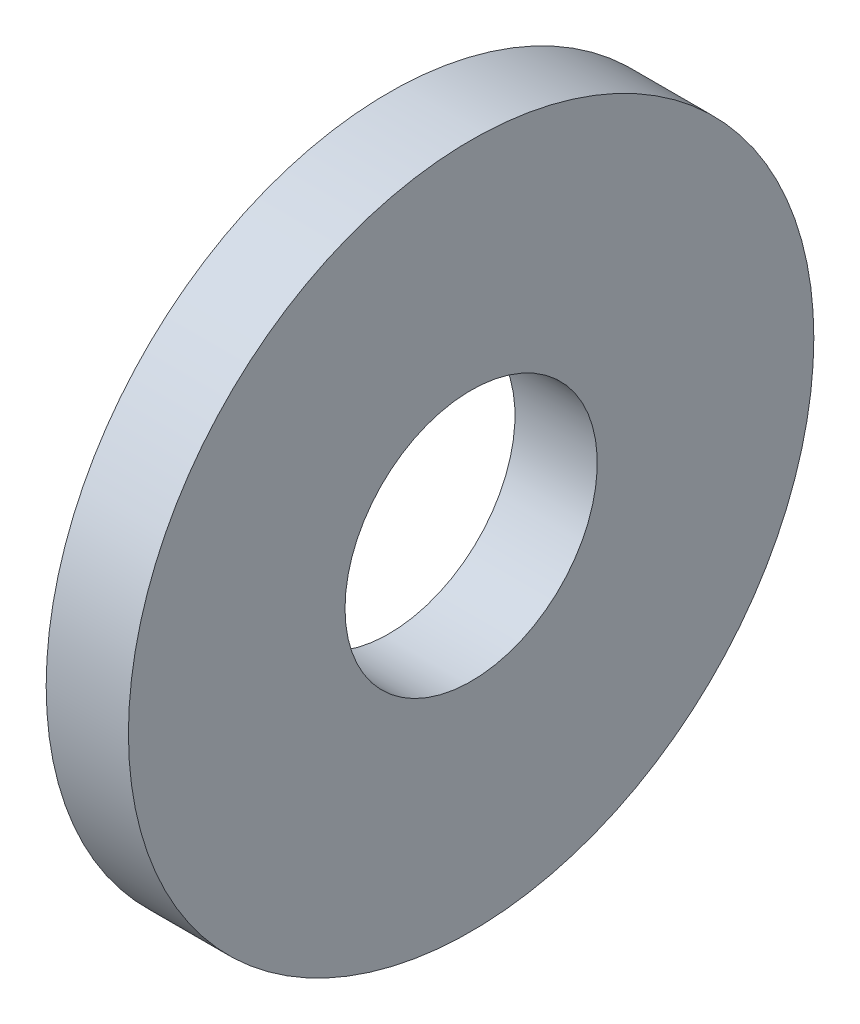
ISO-10303-21;
HEADER;
FILE_DESCRIPTION(('STEP AP214'),'2;1');
FILE_NAME('part.step','',(''),(''),'','','');
FILE_SCHEMA(('AUTOMOTIVE_DESIGN { 1 0 10303 214 1 1 1 1 }'));
ENDSEC;
DATA;
#1=APPLICATION_CONTEXT('core data for automotive mechanical design processes');
#2=APPLICATION_PROTOCOL_DEFINITION('international standard','automotive_design',2000,#1);
#3=PRODUCT_CONTEXT('',#1,'mechanical');
#4=PRODUCT('Part','Part','',(#3));
#5=PRODUCT_RELATED_PRODUCT_CATEGORY('part','',(#4));
#6=PRODUCT_DEFINITION_FORMATION('','',#4);
#7=PRODUCT_DEFINITION_CONTEXT('part definition',#1,'design');
#8=PRODUCT_DEFINITION('design','',#6,#7);
#9=PRODUCT_DEFINITION_SHAPE('','',#8);
#10=(LENGTH_UNIT() NAMED_UNIT(*) SI_UNIT(.MILLI.,.METRE.));
#11=(NAMED_UNIT(*) PLANE_ANGLE_UNIT() SI_UNIT($,.RADIAN.));
#12=(NAMED_UNIT(*) SI_UNIT($,.STERADIAN.) SOLID_ANGLE_UNIT());
#13=UNCERTAINTY_MEASURE_WITH_UNIT(LENGTH_MEASURE(1.E-05),#10,'distance_accuracy_value','');
#14=(GEOMETRIC_REPRESENTATION_CONTEXT(3) GLOBAL_UNCERTAINTY_ASSIGNED_CONTEXT((#13)) GLOBAL_UNIT_ASSIGNED_CONTEXT((#10,
#11,#12)) REPRESENTATION_CONTEXT('',''));
#15=CARTESIAN_POINT('',(0.,0.,0.));
#16=DIRECTION('',(0.,0.,1.));
#17=DIRECTION('',(1.,0.,0.));
#18=AXIS2_PLACEMENT_3D('',#15,#16,#17);
#19=CARTESIAN_POINT('',(-34.9249999999999,0.,0.));
#20=DIRECTION('',(-1.,0.,0.));
#21=DIRECTION('',(0.,0.,1.));
#22=AXIS2_PLACEMENT_3D('',#19,#20,#21);
#23=CYLINDRICAL_SURFACE('',#22,1.84);
#24=CARTESIAN_POINT('',(0.,0.,0.));
#25=DIRECTION('',(-1.,0.,0.));
#26=DIRECTION('',(0.,0.,1.));
#27=AXIS2_PLACEMENT_3D('',#24,#25,#26);
#28=CIRCLE('',#27,1.84);
#29=CARTESIAN_POINT('',(0.,0.,1.84));
#30=VERTEX_POINT('',#29);
#31=EDGE_CURVE('E10',#30,#30,#28,.T.);
#32=ORIENTED_EDGE('',*,*,#31,.F.);
#33=EDGE_LOOP('',(#32));
#34=FACE_BOUND('',#33,.T.);
#35=CARTESIAN_POINT('',(-1.2,0.,0.));
#36=DIRECTION('',(-1.,0.,0.));
#37=DIRECTION('',(0.,0.,1.));
#38=AXIS2_PLACEMENT_3D('',#35,#36,#37);
#39=CIRCLE('',#38,1.84);
#40=CARTESIAN_POINT('',(-1.2,0.,1.84));
#41=VERTEX_POINT('',#40);
#42=EDGE_CURVE('E45',#41,#41,#39,.T.);
#43=ORIENTED_EDGE('',*,*,#42,.T.);
#44=EDGE_LOOP('',(#43));
#45=FACE_BOUND('',#44,.T.);
#46=ADVANCED_FACE('F31',(#34,#45),#23,.F.);
#47=CARTESIAN_POINT('',(0.,1.84,0.));
#48=DIRECTION('',(-1.,0.,0.));
#49=DIRECTION('',(0.,0.,1.));
#50=AXIS2_PLACEMENT_3D('',#47,#48,#49);
#51=PLANE('',#50);
#52=CARTESIAN_POINT('',(0.,0.,0.));
#53=DIRECTION('',(-1.,0.,0.));
#54=DIRECTION('',(0.,0.,1.));
#55=AXIS2_PLACEMENT_3D('',#52,#53,#54);
#56=CIRCLE('',#55,5.);
#57=CARTESIAN_POINT('',(0.,0.,5.));
#58=VERTEX_POINT('',#57);
#59=EDGE_CURVE('E37',#58,#58,#56,.T.);
#60=ORIENTED_EDGE('',*,*,#59,.F.);
#61=EDGE_LOOP('',(#60));
#62=FACE_BOUND('',#61,.T.);
#63=ORIENTED_EDGE('',*,*,#31,.T.);
#64=EDGE_LOOP('',(#63));
#65=FACE_BOUND('',#64,.T.);
#66=ADVANCED_FACE('F60',(#62,#65),#51,.F.);
#67=CARTESIAN_POINT('',(-34.9249999999999,0.,0.));
#68=DIRECTION('',(-1.,0.,0.));
#69=DIRECTION('',(0.,0.,1.));
#70=AXIS2_PLACEMENT_3D('',#67,#68,#69);
#71=CYLINDRICAL_SURFACE('',#70,5.);
#72=CARTESIAN_POINT('',(-1.2,0.,0.));
#73=DIRECTION('',(-1.,0.,0.));
#74=DIRECTION('',(0.,0.,1.));
#75=AXIS2_PLACEMENT_3D('',#72,#73,#74);
#76=CIRCLE('',#75,5.);
#77=CARTESIAN_POINT('',(-1.2,0.,5.));
#78=VERTEX_POINT('',#77);
#79=EDGE_CURVE('E41',#78,#78,#76,.T.);
#80=ORIENTED_EDGE('',*,*,#79,.F.);
#81=EDGE_LOOP('',(#80));
#82=FACE_BOUND('',#81,.T.);
#83=ORIENTED_EDGE('',*,*,#59,.T.);
#84=EDGE_LOOP('',(#83));
#85=FACE_BOUND('',#84,.T.);
#86=ADVANCED_FACE('F55',(#82,#85),#71,.T.);
#87=CARTESIAN_POINT('',(-1.2,5.,0.));
#88=DIRECTION('',(1.,0.,0.));
#89=DIRECTION('',(0.,0.,-1.));
#90=AXIS2_PLACEMENT_3D('',#87,#88,#89);
#91=PLANE('',#90);
#92=ORIENTED_EDGE('',*,*,#42,.F.);
#93=EDGE_LOOP('',(#92));
#94=FACE_BOUND('',#93,.T.);
#95=ORIENTED_EDGE('',*,*,#79,.T.);
#96=EDGE_LOOP('',(#95));
#97=FACE_BOUND('',#96,.T.);
#98=ADVANCED_FACE('F52',(#94,#97),#91,.F.);
#99=CLOSED_SHELL('',(#46,#66,#86,#98));
#100=MANIFOLD_SOLID_BREP('B2',#99);
#101=ADVANCED_BREP_SHAPE_REPRESENTATION('',(#18,#100),#14);
#102=SHAPE_DEFINITION_REPRESENTATION(#9,#101);
ENDSEC;
END-ISO-10303-21;
